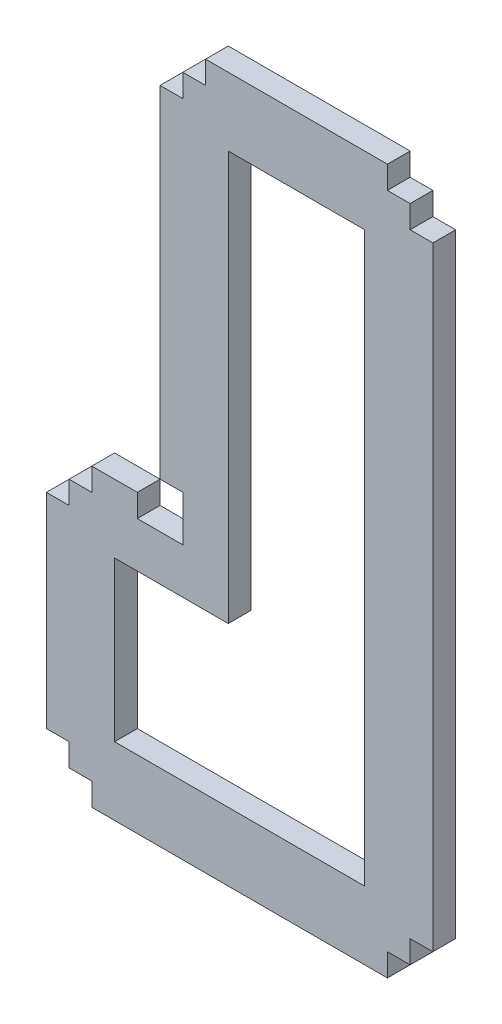
ISO-10303-21;
HEADER;
FILE_DESCRIPTION(('STEP AP214'),'2;1');
FILE_NAME('part.step','',(''),(''),'','','');
FILE_SCHEMA(('AUTOMOTIVE_DESIGN { 1 0 10303 214 1 1 1 1 }'));
ENDSEC;
DATA;
#1=APPLICATION_CONTEXT('core data for automotive mechanical design processes');
#2=APPLICATION_PROTOCOL_DEFINITION('international standard','automotive_design',2000,#1);
#3=PRODUCT_CONTEXT('',#1,'mechanical');
#4=PRODUCT('Part','Part','',(#3));
#5=PRODUCT_RELATED_PRODUCT_CATEGORY('part','',(#4));
#6=PRODUCT_DEFINITION_FORMATION('','',#4);
#7=PRODUCT_DEFINITION_CONTEXT('part definition',#1,'design');
#8=PRODUCT_DEFINITION('design','',#6,#7);
#9=PRODUCT_DEFINITION_SHAPE('','',#8);
#10=(LENGTH_UNIT() NAMED_UNIT(*) SI_UNIT(.MILLI.,.METRE.));
#11=(NAMED_UNIT(*) PLANE_ANGLE_UNIT() SI_UNIT($,.RADIAN.));
#12=(NAMED_UNIT(*) SI_UNIT($,.STERADIAN.) SOLID_ANGLE_UNIT());
#13=UNCERTAINTY_MEASURE_WITH_UNIT(LENGTH_MEASURE(1.E-05),#10,'distance_accuracy_value','');
#14=(GEOMETRIC_REPRESENTATION_CONTEXT(3) GLOBAL_UNCERTAINTY_ASSIGNED_CONTEXT((#13)) GLOBAL_UNIT_ASSIGNED_CONTEXT((#10,
#11,#12)) REPRESENTATION_CONTEXT('',''));
#15=CARTESIAN_POINT('',(0.,0.,0.));
#16=DIRECTION('',(0.,0.,1.));
#17=DIRECTION('',(1.,0.,0.));
#18=AXIS2_PLACEMENT_3D('',#15,#16,#17);
#19=CARTESIAN_POINT('',(12.7,-63.5,-9.525));
#20=DIRECTION('',(-1.,0.,0.));
#21=DIRECTION('',(0.,0.,1.));
#22=AXIS2_PLACEMENT_3D('',#19,#20,#21);
#23=PLANE('',#22);
#24=DIRECTION('',(0.,-1.,0.));
#25=VECTOR('',#24,1.);
#26=CARTESIAN_POINT('',(12.7,-63.5,-3.175));
#27=LINE('',#26,#25);
#28=CARTESIAN_POINT('',(12.7,-63.5,-3.175));
#29=VERTEX_POINT('',#28);
#30=CARTESIAN_POINT('',(12.7,-69.85,-3.175));
#31=VERTEX_POINT('',#30);
#32=EDGE_CURVE('E311',#29,#31,#27,.T.);
#33=ORIENTED_EDGE('',*,*,#32,.F.);
#34=DIRECTION('',(0.,0.,1.));
#35=VECTOR('',#34,1.);
#36=CARTESIAN_POINT('',(12.7,-63.5,-9.525));
#37=LINE('',#36,#35);
#38=CARTESIAN_POINT('',(12.7,-63.5,-9.525));
#39=VERTEX_POINT('',#38);
#40=EDGE_CURVE('E11',#39,#29,#37,.T.);
#41=ORIENTED_EDGE('',*,*,#40,.F.);
#42=DIRECTION('',(0.,-1.,0.));
#43=VECTOR('',#42,1.);
#44=CARTESIAN_POINT('',(12.7,-63.5,-9.525));
#45=LINE('',#44,#43);
#46=CARTESIAN_POINT('',(12.7,-69.85,-9.525));
#47=VERTEX_POINT('',#46);
#48=EDGE_CURVE('E319',#39,#47,#45,.T.);
#49=ORIENTED_EDGE('',*,*,#48,.T.);
#50=DIRECTION('',(0.,0.,1.));
#51=VECTOR('',#50,1.);
#52=CARTESIAN_POINT('',(12.7,-69.85,-9.525));
#53=LINE('',#52,#51);
#54=EDGE_CURVE('E36',#47,#31,#53,.T.);
#55=ORIENTED_EDGE('',*,*,#54,.T.);
#56=EDGE_LOOP('',(#33,#41,#49,#55));
#57=FACE_BOUND('',#56,.T.);
#58=ADVANCED_FACE('F33',(#57),#23,.T.);
#59=CARTESIAN_POINT('',(12.7,-63.5,-9.525));
#60=DIRECTION('',(0.,-1.,0.));
#61=DIRECTION('',(0.,0.,-1.));
#62=AXIS2_PLACEMENT_3D('',#59,#60,#61);
#63=PLANE('',#62);
#64=DIRECTION('',(1.,0.,0.));
#65=VECTOR('',#64,1.);
#66=CARTESIAN_POINT('',(12.7,-63.5,-3.175));
#67=LINE('',#66,#65);
#68=CARTESIAN_POINT('',(6.35000000000001,-63.5,-3.175));
#69=VERTEX_POINT('',#68);
#70=EDGE_CURVE('E323',#69,#29,#67,.T.);
#71=ORIENTED_EDGE('',*,*,#70,.F.);
#72=DIRECTION('',(0.,0.,1.));
#73=VECTOR('',#72,1.);
#74=CARTESIAN_POINT('',(6.35000000000001,-63.5,-9.525));
#75=LINE('',#74,#73);
#76=CARTESIAN_POINT('',(6.35000000000001,-63.5,-9.525));
#77=VERTEX_POINT('',#76);
#78=EDGE_CURVE('E41',#77,#69,#75,.T.);
#79=ORIENTED_EDGE('',*,*,#78,.F.);
#80=DIRECTION('',(1.,0.,0.));
#81=VECTOR('',#80,1.);
#82=CARTESIAN_POINT('',(12.7,-63.5,-9.525));
#83=LINE('',#82,#81);
#84=EDGE_CURVE('E407',#77,#39,#83,.T.);
#85=ORIENTED_EDGE('',*,*,#84,.T.);
#86=ORIENTED_EDGE('',*,*,#40,.T.);
#87=EDGE_LOOP('',(#71,#79,#85,#86));
#88=FACE_BOUND('',#87,.T.);
#89=ADVANCED_FACE('F564',(#88),#63,.T.);
#90=CARTESIAN_POINT('',(6.35000000000001,-63.5,-9.525));
#91=DIRECTION('',(-1.,0.,0.));
#92=DIRECTION('',(0.,0.,1.));
#93=AXIS2_PLACEMENT_3D('',#90,#91,#92);
#94=PLANE('',#93);
#95=DIRECTION('',(0.,-1.,0.));
#96=VECTOR('',#95,1.);
#97=CARTESIAN_POINT('',(6.35000000000001,-63.5,-3.175));
#98=LINE('',#97,#96);
#99=CARTESIAN_POINT('',(6.35000000000001,-6.34999999999999,-3.175));
#100=VERTEX_POINT('',#99);
#101=EDGE_CURVE('E493',#100,#69,#98,.T.);
#102=ORIENTED_EDGE('',*,*,#101,.F.);
#103=DIRECTION('',(0.,0.,1.));
#104=VECTOR('',#103,1.);
#105=CARTESIAN_POINT('',(6.35000000000001,-6.34999999999999,-9.525));
#106=LINE('',#105,#104);
#107=CARTESIAN_POINT('',(6.35000000000001,-6.34999999999999,-9.525));
#108=VERTEX_POINT('',#107);
#109=EDGE_CURVE('E499',#108,#100,#106,.T.);
#110=ORIENTED_EDGE('',*,*,#109,.F.);
#111=DIRECTION('',(0.,-1.,0.));
#112=VECTOR('',#111,1.);
#113=CARTESIAN_POINT('',(6.35000000000001,-63.5,-9.525));
#114=LINE('',#113,#112);
#115=EDGE_CURVE('E404',#108,#77,#114,.T.);
#116=ORIENTED_EDGE('',*,*,#115,.T.);
#117=ORIENTED_EDGE('',*,*,#78,.T.);
#118=EDGE_LOOP('',(#102,#110,#116,#117));
#119=FACE_BOUND('',#118,.T.);
#120=ADVANCED_FACE('F671',(#119),#94,.T.);
#121=CARTESIAN_POINT('',(12.7,-6.34999999999999,-9.525));
#122=DIRECTION('',(0.,1.,0.));
#123=DIRECTION('',(-1.,0.,0.));
#124=AXIS2_PLACEMENT_3D('',#121,#122,#123);
#125=PLANE('',#124);
#126=DIRECTION('',(-1.,0.,0.));
#127=VECTOR('',#126,1.);
#128=CARTESIAN_POINT('',(12.7,-6.34999999999999,-3.175));
#129=LINE('',#128,#127);
#130=CARTESIAN_POINT('',(12.7,-6.34999999999999,-3.175));
#131=VERTEX_POINT('',#130);
#132=EDGE_CURVE('E490',#131,#100,#129,.T.);
#133=ORIENTED_EDGE('',*,*,#132,.F.);
#134=DIRECTION('',(0.,0.,1.));
#135=VECTOR('',#134,1.);
#136=CARTESIAN_POINT('',(12.7,-6.34999999999999,-9.525));
#137=LINE('',#136,#135);
#138=CARTESIAN_POINT('',(12.7,-6.34999999999999,-9.525));
#139=VERTEX_POINT('',#138);
#140=EDGE_CURVE('E501',#139,#131,#137,.T.);
#141=ORIENTED_EDGE('',*,*,#140,.F.);
#142=DIRECTION('',(-1.,0.,0.));
#143=VECTOR('',#142,1.);
#144=CARTESIAN_POINT('',(12.7,-6.34999999999999,-9.525));
#145=LINE('',#144,#143);
#146=EDGE_CURVE('E401',#139,#108,#145,.T.);
#147=ORIENTED_EDGE('',*,*,#146,.T.);
#148=ORIENTED_EDGE('',*,*,#109,.T.);
#149=EDGE_LOOP('',(#133,#141,#147,#148));
#150=FACE_BOUND('',#149,.T.);
#151=ADVANCED_FACE('F668',(#150),#125,.T.);
#152=CARTESIAN_POINT('',(12.7,0.,-9.525));
#153=DIRECTION('',(-1.,0.,0.));
#154=DIRECTION('',(0.,0.,1.));
#155=AXIS2_PLACEMENT_3D('',#152,#153,#154);
#156=PLANE('',#155);
#157=DIRECTION('',(0.,-1.,0.));
#158=VECTOR('',#157,1.);
#159=CARTESIAN_POINT('',(12.7,0.,-3.175));
#160=LINE('',#159,#158);
#161=CARTESIAN_POINT('',(12.7,0.,-3.175));
#162=VERTEX_POINT('',#161);
#163=EDGE_CURVE('E487',#162,#131,#160,.T.);
#164=ORIENTED_EDGE('',*,*,#163,.F.);
#165=DIRECTION('',(0.,0.,1.));
#166=VECTOR('',#165,1.);
#167=CARTESIAN_POINT('',(12.7,0.,-9.525));
#168=LINE('',#167,#166);
#169=CARTESIAN_POINT('',(12.7,0.,-9.525));
#170=VERTEX_POINT('',#169);
#171=EDGE_CURVE('E503',#170,#162,#168,.T.);
#172=ORIENTED_EDGE('',*,*,#171,.F.);
#173=DIRECTION('',(0.,-1.,0.));
#174=VECTOR('',#173,1.);
#175=CARTESIAN_POINT('',(12.7,0.,-9.525));
#176=LINE('',#175,#174);
#177=EDGE_CURVE('E398',#170,#139,#176,.T.);
#178=ORIENTED_EDGE('',*,*,#177,.T.);
#179=ORIENTED_EDGE('',*,*,#140,.T.);
#180=EDGE_LOOP('',(#164,#172,#178,#179));
#181=FACE_BOUND('',#180,.T.);
#182=ADVANCED_FACE('F665',(#181),#156,.T.);
#183=CARTESIAN_POINT('',(19.05,0.,-9.525));
#184=DIRECTION('',(0.,1.,0.));
#185=DIRECTION('',(-1.,0.,0.));
#186=AXIS2_PLACEMENT_3D('',#183,#184,#185);
#187=PLANE('',#186);
#188=DIRECTION('',(-1.,0.,0.));
#189=VECTOR('',#188,1.);
#190=CARTESIAN_POINT('',(19.05,0.,-3.175));
#191=LINE('',#190,#189);
#192=CARTESIAN_POINT('',(19.05,0.,-3.175));
#193=VERTEX_POINT('',#192);
#194=EDGE_CURVE('E484',#193,#162,#191,.T.);
#195=ORIENTED_EDGE('',*,*,#194,.F.);
#196=DIRECTION('',(0.,0.,1.));
#197=VECTOR('',#196,1.);
#198=CARTESIAN_POINT('',(19.05,0.,-9.525));
#199=LINE('',#198,#197);
#200=CARTESIAN_POINT('',(19.05,0.,-9.525));
#201=VERTEX_POINT('',#200);
#202=EDGE_CURVE('E505',#201,#193,#199,.T.);
#203=ORIENTED_EDGE('',*,*,#202,.F.);
#204=DIRECTION('',(-1.,0.,0.));
#205=VECTOR('',#204,1.);
#206=CARTESIAN_POINT('',(19.05,0.,-9.525));
#207=LINE('',#206,#205);
#208=EDGE_CURVE('E395',#201,#170,#207,.T.);
#209=ORIENTED_EDGE('',*,*,#208,.T.);
#210=ORIENTED_EDGE('',*,*,#171,.T.);
#211=EDGE_LOOP('',(#195,#203,#209,#210));
#212=FACE_BOUND('',#211,.T.);
#213=ADVANCED_FACE('F661',(#212),#187,.T.);
#214=CARTESIAN_POINT('',(19.05,0.,-9.525));
#215=DIRECTION('',(-1.,0.,0.));
#216=DIRECTION('',(0.,0.,1.));
#217=AXIS2_PLACEMENT_3D('',#214,#215,#216);
#218=PLANE('',#217);
#219=DIRECTION('',(0.,-1.,0.));
#220=VECTOR('',#219,1.);
#221=CARTESIAN_POINT('',(19.05,0.,-3.175));
#222=LINE('',#221,#220);
#223=CARTESIAN_POINT('',(19.05,6.35,-3.175));
#224=VERTEX_POINT('',#223);
#225=EDGE_CURVE('E481',#224,#193,#222,.T.);
#226=ORIENTED_EDGE('',*,*,#225,.F.);
#227=DIRECTION('',(0.,0.,1.));
#228=VECTOR('',#227,1.);
#229=CARTESIAN_POINT('',(19.05,6.35,-9.525));
#230=LINE('',#229,#228);
#231=CARTESIAN_POINT('',(19.05,6.35,-9.525));
#232=VERTEX_POINT('',#231);
#233=EDGE_CURVE('E507',#232,#224,#230,.T.);
#234=ORIENTED_EDGE('',*,*,#233,.F.);
#235=DIRECTION('',(0.,-1.,0.));
#236=VECTOR('',#235,1.);
#237=CARTESIAN_POINT('',(19.05,0.,-9.525));
#238=LINE('',#237,#236);
#239=EDGE_CURVE('E392',#232,#201,#238,.T.);
#240=ORIENTED_EDGE('',*,*,#239,.T.);
#241=ORIENTED_EDGE('',*,*,#202,.T.);
#242=EDGE_LOOP('',(#226,#234,#240,#241));
#243=FACE_BOUND('',#242,.T.);
#244=ADVANCED_FACE('F657',(#243),#218,.T.);
#245=CARTESIAN_POINT('',(19.05,6.35,-9.525));
#246=DIRECTION('',(0.,1.,0.));
#247=DIRECTION('',(0.,0.,1.));
#248=AXIS2_PLACEMENT_3D('',#245,#246,#247);
#249=PLANE('',#248);
#250=DIRECTION('',(-1.,0.,0.));
#251=VECTOR('',#250,1.);
#252=CARTESIAN_POINT('',(19.05,6.35,-3.175));
#253=LINE('',#252,#251);
#254=CARTESIAN_POINT('',(31.75,6.35,-3.175));
#255=VERTEX_POINT('',#254);
#256=EDGE_CURVE('E478',#255,#224,#253,.T.);
#257=ORIENTED_EDGE('',*,*,#256,.F.);
#258=DIRECTION('',(0.,0.,1.));
#259=VECTOR('',#258,1.);
#260=CARTESIAN_POINT('',(31.75,6.35,-9.525));
#261=LINE('',#260,#259);
#262=CARTESIAN_POINT('',(31.75,6.35,-9.525));
#263=VERTEX_POINT('',#262);
#264=EDGE_CURVE('E509',#263,#255,#261,.T.);
#265=ORIENTED_EDGE('',*,*,#264,.F.);
#266=DIRECTION('',(-1.,0.,0.));
#267=VECTOR('',#266,1.);
#268=CARTESIAN_POINT('',(19.05,6.35,-9.525));
#269=LINE('',#268,#267);
#270=EDGE_CURVE('E389',#263,#232,#269,.T.);
#271=ORIENTED_EDGE('',*,*,#270,.T.);
#272=ORIENTED_EDGE('',*,*,#233,.T.);
#273=EDGE_LOOP('',(#257,#265,#271,#272));
#274=FACE_BOUND('',#273,.T.);
#275=ADVANCED_FACE('F653',(#274),#249,.T.);
#276=CARTESIAN_POINT('',(31.75,0.,-9.525));
#277=DIRECTION('',(1.,0.,0.));
#278=DIRECTION('',(0.,0.,-1.));
#279=AXIS2_PLACEMENT_3D('',#276,#277,#278);
#280=PLANE('',#279);
#281=DIRECTION('',(0.,1.,0.));
#282=VECTOR('',#281,1.);
#283=CARTESIAN_POINT('',(31.75,0.,-3.175));
#284=LINE('',#283,#282);
#285=CARTESIAN_POINT('',(31.75,0.,-3.175));
#286=VERTEX_POINT('',#285);
#287=EDGE_CURVE('E475',#286,#255,#284,.T.);
#288=ORIENTED_EDGE('',*,*,#287,.F.);
#289=DIRECTION('',(0.,0.,1.));
#290=VECTOR('',#289,1.);
#291=CARTESIAN_POINT('',(31.75,0.,-9.525));
#292=LINE('',#291,#290);
#293=CARTESIAN_POINT('',(31.75,0.,-9.525));
#294=VERTEX_POINT('',#293);
#295=EDGE_CURVE('E511',#294,#286,#292,.T.);
#296=ORIENTED_EDGE('',*,*,#295,.F.);
#297=DIRECTION('',(0.,1.,0.));
#298=VECTOR('',#297,1.);
#299=CARTESIAN_POINT('',(31.75,0.,-9.525));
#300=LINE('',#299,#298);
#301=EDGE_CURVE('E386',#294,#263,#300,.T.);
#302=ORIENTED_EDGE('',*,*,#301,.T.);
#303=ORIENTED_EDGE('',*,*,#264,.T.);
#304=EDGE_LOOP('',(#288,#296,#302,#303));
#305=FACE_BOUND('',#304,.T.);
#306=ADVANCED_FACE('F649',(#305),#280,.T.);
#307=CARTESIAN_POINT('',(44.45,0.,-9.525));
#308=DIRECTION('',(0.,1.,0.));
#309=DIRECTION('',(-1.,0.,0.));
#310=AXIS2_PLACEMENT_3D('',#307,#308,#309);
#311=PLANE('',#310);
#312=DIRECTION('',(-1.,0.,0.));
#313=VECTOR('',#312,1.);
#314=CARTESIAN_POINT('',(44.45,0.,-3.175));
#315=LINE('',#314,#313);
#316=CARTESIAN_POINT('',(44.45,0.,-3.175));
#317=VERTEX_POINT('',#316);
#318=EDGE_CURVE('E472',#317,#286,#315,.T.);
#319=ORIENTED_EDGE('',*,*,#318,.F.);
#320=DIRECTION('',(0.,0.,1.));
#321=VECTOR('',#320,1.);
#322=CARTESIAN_POINT('',(44.45,0.,-9.525));
#323=LINE('',#322,#321);
#324=CARTESIAN_POINT('',(44.45,0.,-9.525));
#325=VERTEX_POINT('',#324);
#326=EDGE_CURVE('E513',#325,#317,#323,.T.);
#327=ORIENTED_EDGE('',*,*,#326,.F.);
#328=DIRECTION('',(-1.,0.,0.));
#329=VECTOR('',#328,1.);
#330=CARTESIAN_POINT('',(44.45,0.,-9.525));
#331=LINE('',#330,#329);
#332=EDGE_CURVE('E383',#325,#294,#331,.T.);
#333=ORIENTED_EDGE('',*,*,#332,.T.);
#334=ORIENTED_EDGE('',*,*,#295,.T.);
#335=EDGE_LOOP('',(#319,#327,#333,#334));
#336=FACE_BOUND('',#335,.T.);
#337=ADVANCED_FACE('F645',(#336),#311,.T.);
#338=CARTESIAN_POINT('',(44.45,12.7,-9.525));
#339=DIRECTION('',(-1.,0.,0.));
#340=DIRECTION('',(0.,-1.,0.));
#341=AXIS2_PLACEMENT_3D('',#338,#339,#340);
#342=PLANE('',#341);
#343=DIRECTION('',(0.,-1.,0.));
#344=VECTOR('',#343,1.);
#345=CARTESIAN_POINT('',(44.45,12.7,-3.175));
#346=LINE('',#345,#344);
#347=CARTESIAN_POINT('',(44.45,12.7,-3.175));
#348=VERTEX_POINT('',#347);
#349=EDGE_CURVE('E469',#348,#317,#346,.T.);
#350=ORIENTED_EDGE('',*,*,#349,.F.);
#351=DIRECTION('',(0.,0.,1.));
#352=VECTOR('',#351,1.);
#353=CARTESIAN_POINT('',(44.45,12.7,-9.525));
#354=LINE('',#353,#352);
#355=CARTESIAN_POINT('',(44.45,12.7,-9.525));
#356=VERTEX_POINT('',#355);
#357=EDGE_CURVE('E515',#356,#348,#354,.T.);
#358=ORIENTED_EDGE('',*,*,#357,.F.);
#359=DIRECTION('',(0.,-1.,0.));
#360=VECTOR('',#359,1.);
#361=CARTESIAN_POINT('',(44.45,12.7,-9.525));
#362=LINE('',#361,#360);
#363=EDGE_CURVE('E380',#356,#325,#362,.T.);
#364=ORIENTED_EDGE('',*,*,#363,.T.);
#365=ORIENTED_EDGE('',*,*,#326,.T.);
#366=EDGE_LOOP('',(#350,#358,#364,#365));
#367=FACE_BOUND('',#366,.T.);
#368=ADVANCED_FACE('F641',(#367),#342,.T.);
#369=CARTESIAN_POINT('',(44.45,12.7,-9.525));
#370=DIRECTION('',(0.,-1.,0.));
#371=DIRECTION('',(1.,0.,0.));
#372=AXIS2_PLACEMENT_3D('',#369,#370,#371);
#373=PLANE('',#372);
#374=DIRECTION('',(1.,0.,0.));
#375=VECTOR('',#374,1.);
#376=CARTESIAN_POINT('',(44.45,12.7,-3.175));
#377=LINE('',#376,#375);
#378=CARTESIAN_POINT('',(38.1,12.7,-3.175));
#379=VERTEX_POINT('',#378);
#380=EDGE_CURVE('E466',#379,#348,#377,.T.);
#381=ORIENTED_EDGE('',*,*,#380,.F.);
#382=DIRECTION('',(0.,0.,1.));
#383=VECTOR('',#382,1.);
#384=CARTESIAN_POINT('',(38.1,12.7,-9.525));
#385=LINE('',#384,#383);
#386=CARTESIAN_POINT('',(38.1,12.7,-9.525));
#387=VERTEX_POINT('',#386);
#388=EDGE_CURVE('E517',#387,#379,#385,.T.);
#389=ORIENTED_EDGE('',*,*,#388,.F.);
#390=DIRECTION('',(1.,0.,0.));
#391=VECTOR('',#390,1.);
#392=CARTESIAN_POINT('',(44.45,12.7,-9.525));
#393=LINE('',#392,#391);
#394=EDGE_CURVE('E377',#387,#356,#393,.T.);
#395=ORIENTED_EDGE('',*,*,#394,.T.);
#396=ORIENTED_EDGE('',*,*,#357,.T.);
#397=EDGE_LOOP('',(#381,#389,#395,#396));
#398=FACE_BOUND('',#397,.T.);
#399=ADVANCED_FACE('F637',(#398),#373,.T.);
#400=CARTESIAN_POINT('',(38.1,107.95,-9.525));
#401=DIRECTION('',(-1.,0.,0.));
#402=DIRECTION('',(0.,0.,1.));
#403=AXIS2_PLACEMENT_3D('',#400,#401,#402);
#404=PLANE('',#403);
#405=DIRECTION('',(0.,-1.,0.));
#406=VECTOR('',#405,1.);
#407=CARTESIAN_POINT('',(38.1,107.95,-3.175));
#408=LINE('',#407,#406);
#409=CARTESIAN_POINT('',(38.1,107.95,-3.175));
#410=VERTEX_POINT('',#409);
#411=EDGE_CURVE('E463',#410,#379,#408,.T.);
#412=ORIENTED_EDGE('',*,*,#411,.F.);
#413=DIRECTION('',(0.,0.,1.));
#414=VECTOR('',#413,1.);
#415=CARTESIAN_POINT('',(38.1,107.95,-9.525));
#416=LINE('',#415,#414);
#417=CARTESIAN_POINT('',(38.1,107.95,-9.525));
#418=VERTEX_POINT('',#417);
#419=EDGE_CURVE('E519',#418,#410,#416,.T.);
#420=ORIENTED_EDGE('',*,*,#419,.F.);
#421=DIRECTION('',(0.,-1.,0.));
#422=VECTOR('',#421,1.);
#423=CARTESIAN_POINT('',(38.1,107.95,-9.525));
#424=LINE('',#423,#422);
#425=EDGE_CURVE('E374',#418,#387,#424,.T.);
#426=ORIENTED_EDGE('',*,*,#425,.T.);
#427=ORIENTED_EDGE('',*,*,#388,.T.);
#428=EDGE_LOOP('',(#412,#420,#426,#427));
#429=FACE_BOUND('',#428,.T.);
#430=ADVANCED_FACE('F633',(#429),#404,.T.);
#431=CARTESIAN_POINT('',(44.45,107.95,-9.525));
#432=DIRECTION('',(0.,1.,0.));
#433=DIRECTION('',(0.,0.,1.));
#434=AXIS2_PLACEMENT_3D('',#431,#432,#433);
#435=PLANE('',#434);
#436=DIRECTION('',(-1.,0.,0.));
#437=VECTOR('',#436,1.);
#438=CARTESIAN_POINT('',(44.45,107.95,-3.175));
#439=LINE('',#438,#437);
#440=CARTESIAN_POINT('',(44.45,107.95,-3.175));
#441=VERTEX_POINT('',#440);
#442=EDGE_CURVE('E460',#441,#410,#439,.T.);
#443=ORIENTED_EDGE('',*,*,#442,.F.);
#444=DIRECTION('',(0.,0.,1.));
#445=VECTOR('',#444,1.);
#446=CARTESIAN_POINT('',(44.45,107.95,-9.525));
#447=LINE('',#446,#445);
#448=CARTESIAN_POINT('',(44.45,107.95,-9.525));
#449=VERTEX_POINT('',#448);
#450=EDGE_CURVE('E521',#449,#441,#447,.T.);
#451=ORIENTED_EDGE('',*,*,#450,.F.);
#452=DIRECTION('',(-1.,0.,0.));
#453=VECTOR('',#452,1.);
#454=CARTESIAN_POINT('',(44.45,107.95,-9.525));
#455=LINE('',#454,#453);
#456=EDGE_CURVE('E371',#449,#418,#455,.T.);
#457=ORIENTED_EDGE('',*,*,#456,.T.);
#458=ORIENTED_EDGE('',*,*,#419,.T.);
#459=EDGE_LOOP('',(#443,#451,#457,#458));
#460=FACE_BOUND('',#459,.T.);
#461=ADVANCED_FACE('F629',(#460),#435,.T.);
#462=CARTESIAN_POINT('',(44.45,114.3,-9.525));
#463=DIRECTION('',(-1.,0.,0.));
#464=DIRECTION('',(0.,0.,1.));
#465=AXIS2_PLACEMENT_3D('',#462,#463,#464);
#466=PLANE('',#465);
#467=DIRECTION('',(0.,-1.,0.));
#468=VECTOR('',#467,1.);
#469=CARTESIAN_POINT('',(44.45,114.3,-3.175));
#470=LINE('',#469,#468);
#471=CARTESIAN_POINT('',(44.45,114.3,-3.175));
#472=VERTEX_POINT('',#471);
#473=EDGE_CURVE('E457',#472,#441,#470,.T.);
#474=ORIENTED_EDGE('',*,*,#473,.F.);
#475=DIRECTION('',(0.,0.,1.));
#476=VECTOR('',#475,1.);
#477=CARTESIAN_POINT('',(44.45,114.3,-9.525));
#478=LINE('',#477,#476);
#479=CARTESIAN_POINT('',(44.45,114.3,-9.525));
#480=VERTEX_POINT('',#479);
#481=EDGE_CURVE('E523',#480,#472,#478,.T.);
#482=ORIENTED_EDGE('',*,*,#481,.F.);
#483=DIRECTION('',(0.,-1.,0.));
#484=VECTOR('',#483,1.);
#485=CARTESIAN_POINT('',(44.45,114.3,-9.525));
#486=LINE('',#485,#484);
#487=EDGE_CURVE('E368',#480,#449,#486,.T.);
#488=ORIENTED_EDGE('',*,*,#487,.T.);
#489=ORIENTED_EDGE('',*,*,#450,.T.);
#490=EDGE_LOOP('',(#474,#482,#488,#489));
#491=FACE_BOUND('',#490,.T.);
#492=ADVANCED_FACE('F625',(#491),#466,.T.);
#493=CARTESIAN_POINT('',(50.8,114.3,-9.525));
#494=DIRECTION('',(0.,1.,0.));
#495=DIRECTION('',(0.,0.,1.));
#496=AXIS2_PLACEMENT_3D('',#493,#494,#495);
#497=PLANE('',#496);
#498=DIRECTION('',(-1.,0.,0.));
#499=VECTOR('',#498,1.);
#500=CARTESIAN_POINT('',(50.8,114.3,-3.175));
#501=LINE('',#500,#499);
#502=CARTESIAN_POINT('',(50.8,114.3,-3.175));
#503=VERTEX_POINT('',#502);
#504=EDGE_CURVE('E454',#503,#472,#501,.T.);
#505=ORIENTED_EDGE('',*,*,#504,.F.);
#506=DIRECTION('',(0.,0.,1.));
#507=VECTOR('',#506,1.);
#508=CARTESIAN_POINT('',(50.8,114.3,-9.525));
#509=LINE('',#508,#507);
#510=CARTESIAN_POINT('',(50.8,114.3,-9.525));
#511=VERTEX_POINT('',#510);
#512=EDGE_CURVE('E525',#511,#503,#509,.T.);
#513=ORIENTED_EDGE('',*,*,#512,.F.);
#514=DIRECTION('',(-1.,0.,0.));
#515=VECTOR('',#514,1.);
#516=CARTESIAN_POINT('',(50.8,114.3,-9.525));
#517=LINE('',#516,#515);
#518=EDGE_CURVE('E365',#511,#480,#517,.T.);
#519=ORIENTED_EDGE('',*,*,#518,.T.);
#520=ORIENTED_EDGE('',*,*,#481,.T.);
#521=EDGE_LOOP('',(#505,#513,#519,#520));
#522=FACE_BOUND('',#521,.T.);
#523=ADVANCED_FACE('F621',(#522),#497,.T.);
#524=CARTESIAN_POINT('',(50.8,114.3,-9.525));
#525=DIRECTION('',(-1.,0.,0.));
#526=DIRECTION('',(0.,0.,1.));
#527=AXIS2_PLACEMENT_3D('',#524,#525,#526);
#528=PLANE('',#527);
#529=DIRECTION('',(0.,-1.,0.));
#530=VECTOR('',#529,1.);
#531=CARTESIAN_POINT('',(50.8,114.3,-3.175));
#532=LINE('',#531,#530);
#533=CARTESIAN_POINT('',(50.8,120.65,-3.175));
#534=VERTEX_POINT('',#533);
#535=EDGE_CURVE('E451',#534,#503,#532,.T.);
#536=ORIENTED_EDGE('',*,*,#535,.F.);
#537=DIRECTION('',(0.,0.,1.));
#538=VECTOR('',#537,1.);
#539=CARTESIAN_POINT('',(50.8,120.65,-9.525));
#540=LINE('',#539,#538);
#541=CARTESIAN_POINT('',(50.8,120.65,-9.525));
#542=VERTEX_POINT('',#541);
#543=EDGE_CURVE('E527',#542,#534,#540,.T.);
#544=ORIENTED_EDGE('',*,*,#543,.F.);
#545=DIRECTION('',(0.,-1.,0.));
#546=VECTOR('',#545,1.);
#547=CARTESIAN_POINT('',(50.8,114.3,-9.525));
#548=LINE('',#547,#546);
#549=EDGE_CURVE('E362',#542,#511,#548,.T.);
#550=ORIENTED_EDGE('',*,*,#549,.T.);
#551=ORIENTED_EDGE('',*,*,#512,.T.);
#552=EDGE_LOOP('',(#536,#544,#550,#551));
#553=FACE_BOUND('',#552,.T.);
#554=ADVANCED_FACE('F617',(#553),#528,.T.);
#555=CARTESIAN_POINT('',(101.6,120.65,-9.525));
#556=DIRECTION('',(0.,1.,0.));
#557=DIRECTION('',(0.,0.,1.));
#558=AXIS2_PLACEMENT_3D('',#555,#556,#557);
#559=PLANE('',#558);
#560=DIRECTION('',(-1.,0.,0.));
#561=VECTOR('',#560,1.);
#562=CARTESIAN_POINT('',(101.6,120.65,-3.175));
#563=LINE('',#562,#561);
#564=CARTESIAN_POINT('',(101.6,120.65,-3.175));
#565=VERTEX_POINT('',#564);
#566=EDGE_CURVE('E448',#565,#534,#563,.T.);
#567=ORIENTED_EDGE('',*,*,#566,.F.);
#568=DIRECTION('',(0.,0.,1.));
#569=VECTOR('',#568,1.);
#570=CARTESIAN_POINT('',(101.6,120.65,-9.525));
#571=LINE('',#570,#569);
#572=CARTESIAN_POINT('',(101.6,120.65,-9.525));
#573=VERTEX_POINT('',#572);
#574=EDGE_CURVE('E529',#573,#565,#571,.T.);
#575=ORIENTED_EDGE('',*,*,#574,.F.);
#576=DIRECTION('',(-1.,0.,0.));
#577=VECTOR('',#576,1.);
#578=CARTESIAN_POINT('',(101.6,120.65,-9.525));
#579=LINE('',#578,#577);
#580=EDGE_CURVE('E359',#573,#542,#579,.T.);
#581=ORIENTED_EDGE('',*,*,#580,.T.);
#582=ORIENTED_EDGE('',*,*,#543,.T.);
#583=EDGE_LOOP('',(#567,#575,#581,#582));
#584=FACE_BOUND('',#583,.T.);
#585=ADVANCED_FACE('F613',(#584),#559,.T.);
#586=CARTESIAN_POINT('',(101.6,114.3,-9.525));
#587=DIRECTION('',(1.,0.,0.));
#588=DIRECTION('',(0.,0.,-1.));
#589=AXIS2_PLACEMENT_3D('',#586,#587,#588);
#590=PLANE('',#589);
#591=DIRECTION('',(0.,1.,0.));
#592=VECTOR('',#591,1.);
#593=CARTESIAN_POINT('',(101.6,114.3,-3.175));
#594=LINE('',#593,#592);
#595=CARTESIAN_POINT('',(101.6,114.3,-3.175));
#596=VERTEX_POINT('',#595);
#597=EDGE_CURVE('E445',#596,#565,#594,.T.);
#598=ORIENTED_EDGE('',*,*,#597,.F.);
#599=DIRECTION('',(0.,0.,1.));
#600=VECTOR('',#599,1.);
#601=CARTESIAN_POINT('',(101.6,114.3,-9.525));
#602=LINE('',#601,#600);
#603=CARTESIAN_POINT('',(101.6,114.3,-9.525));
#604=VERTEX_POINT('',#603);
#605=EDGE_CURVE('E531',#604,#596,#602,.T.);
#606=ORIENTED_EDGE('',*,*,#605,.F.);
#607=DIRECTION('',(0.,1.,0.));
#608=VECTOR('',#607,1.);
#609=CARTESIAN_POINT('',(101.6,114.3,-9.525));
#610=LINE('',#609,#608);
#611=EDGE_CURVE('E356',#604,#573,#610,.T.);
#612=ORIENTED_EDGE('',*,*,#611,.T.);
#613=ORIENTED_EDGE('',*,*,#574,.T.);
#614=EDGE_LOOP('',(#598,#606,#612,#613));
#615=FACE_BOUND('',#614,.T.);
#616=ADVANCED_FACE('F609',(#615),#590,.T.);
#617=CARTESIAN_POINT('',(107.95,114.3,-9.525));
#618=DIRECTION('',(0.,1.,0.));
#619=DIRECTION('',(0.,0.,1.));
#620=AXIS2_PLACEMENT_3D('',#617,#618,#619);
#621=PLANE('',#620);
#622=DIRECTION('',(-1.,0.,0.));
#623=VECTOR('',#622,1.);
#624=CARTESIAN_POINT('',(107.95,114.3,-3.175));
#625=LINE('',#624,#623);
#626=CARTESIAN_POINT('',(107.95,114.3,-3.175));
#627=VERTEX_POINT('',#626);
#628=EDGE_CURVE('E442',#627,#596,#625,.T.);
#629=ORIENTED_EDGE('',*,*,#628,.F.);
#630=DIRECTION('',(0.,0.,1.));
#631=VECTOR('',#630,1.);
#632=CARTESIAN_POINT('',(107.95,114.3,-9.525));
#633=LINE('',#632,#631);
#634=CARTESIAN_POINT('',(107.95,114.3,-9.525));
#635=VERTEX_POINT('',#634);
#636=EDGE_CURVE('E533',#635,#627,#633,.T.);
#637=ORIENTED_EDGE('',*,*,#636,.F.);
#638=DIRECTION('',(-1.,0.,0.));
#639=VECTOR('',#638,1.);
#640=CARTESIAN_POINT('',(107.95,114.3,-9.525));
#641=LINE('',#640,#639);
#642=EDGE_CURVE('E353',#635,#604,#641,.T.);
#643=ORIENTED_EDGE('',*,*,#642,.T.);
#644=ORIENTED_EDGE('',*,*,#605,.T.);
#645=EDGE_LOOP('',(#629,#637,#643,#644));
#646=FACE_BOUND('',#645,.T.);
#647=ADVANCED_FACE('F605',(#646),#621,.T.);
#648=CARTESIAN_POINT('',(107.95,107.95,-9.525));
#649=DIRECTION('',(1.,0.,0.));
#650=DIRECTION('',(0.,1.,0.));
#651=AXIS2_PLACEMENT_3D('',#648,#649,#650);
#652=PLANE('',#651);
#653=DIRECTION('',(0.,1.,0.));
#654=VECTOR('',#653,1.);
#655=CARTESIAN_POINT('',(107.95,107.95,-3.175));
#656=LINE('',#655,#654);
#657=CARTESIAN_POINT('',(107.95,107.95,-3.175));
#658=VERTEX_POINT('',#657);
#659=EDGE_CURVE('E439',#658,#627,#656,.T.);
#660=ORIENTED_EDGE('',*,*,#659,.F.);
#661=DIRECTION('',(0.,0.,1.));
#662=VECTOR('',#661,1.);
#663=CARTESIAN_POINT('',(107.95,107.95,-9.525));
#664=LINE('',#663,#662);
#665=CARTESIAN_POINT('',(107.95,107.95,-9.525));
#666=VERTEX_POINT('',#665);
#667=EDGE_CURVE('E535',#666,#658,#664,.T.);
#668=ORIENTED_EDGE('',*,*,#667,.F.);
#669=DIRECTION('',(0.,1.,0.));
#670=VECTOR('',#669,1.);
#671=CARTESIAN_POINT('',(107.95,107.95,-9.525));
#672=LINE('',#671,#670);
#673=EDGE_CURVE('E350',#666,#635,#672,.T.);
#674=ORIENTED_EDGE('',*,*,#673,.T.);
#675=ORIENTED_EDGE('',*,*,#636,.T.);
#676=EDGE_LOOP('',(#660,#668,#674,#675));
#677=FACE_BOUND('',#676,.T.);
#678=ADVANCED_FACE('F601',(#677),#652,.T.);
#679=CARTESIAN_POINT('',(107.95,107.95,-9.525));
#680=DIRECTION('',(0.,1.,0.));
#681=DIRECTION('',(-1.,0.,0.));
#682=AXIS2_PLACEMENT_3D('',#679,#680,#681);
#683=PLANE('',#682);
#684=DIRECTION('',(-1.,0.,0.));
#685=VECTOR('',#684,1.);
#686=CARTESIAN_POINT('',(107.95,107.95,-3.175));
#687=LINE('',#686,#685);
#688=CARTESIAN_POINT('',(114.3,107.95,-3.175));
#689=VERTEX_POINT('',#688);
#690=EDGE_CURVE('E436',#689,#658,#687,.T.);
#691=ORIENTED_EDGE('',*,*,#690,.F.);
#692=DIRECTION('',(0.,0.,1.));
#693=VECTOR('',#692,1.);
#694=CARTESIAN_POINT('',(114.3,107.95,-9.525));
#695=LINE('',#694,#693);
#696=CARTESIAN_POINT('',(114.3,107.95,-9.525));
#697=VERTEX_POINT('',#696);
#698=EDGE_CURVE('E537',#697,#689,#695,.T.);
#699=ORIENTED_EDGE('',*,*,#698,.F.);
#700=DIRECTION('',(-1.,0.,0.));
#701=VECTOR('',#700,1.);
#702=CARTESIAN_POINT('',(107.95,107.95,-9.525));
#703=LINE('',#702,#701);
#704=EDGE_CURVE('E347',#697,#666,#703,.T.);
#705=ORIENTED_EDGE('',*,*,#704,.T.);
#706=ORIENTED_EDGE('',*,*,#667,.T.);
#707=EDGE_LOOP('',(#691,#699,#705,#706));
#708=FACE_BOUND('',#707,.T.);
#709=ADVANCED_FACE('F597',(#708),#683,.T.);
#710=CARTESIAN_POINT('',(114.3,-63.5,-9.525));
#711=DIRECTION('',(1.,0.,0.));
#712=DIRECTION('',(0.,0.,-1.));
#713=AXIS2_PLACEMENT_3D('',#710,#711,#712);
#714=PLANE('',#713);
#715=DIRECTION('',(0.,1.,0.));
#716=VECTOR('',#715,1.);
#717=CARTESIAN_POINT('',(114.3,-63.5,-3.175));
#718=LINE('',#717,#716);
#719=CARTESIAN_POINT('',(114.3,-63.5,-3.175));
#720=VERTEX_POINT('',#719);
#721=EDGE_CURVE('E433',#720,#689,#718,.T.);
#722=ORIENTED_EDGE('',*,*,#721,.F.);
#723=DIRECTION('',(0.,0.,1.));
#724=VECTOR('',#723,1.);
#725=CARTESIAN_POINT('',(114.3,-63.5,-9.525));
#726=LINE('',#725,#724);
#727=CARTESIAN_POINT('',(114.3,-63.5,-9.525));
#728=VERTEX_POINT('',#727);
#729=EDGE_CURVE('E539',#728,#720,#726,.T.);
#730=ORIENTED_EDGE('',*,*,#729,.F.);
#731=DIRECTION('',(0.,1.,0.));
#732=VECTOR('',#731,1.);
#733=CARTESIAN_POINT('',(114.3,-63.5,-9.525));
#734=LINE('',#733,#732);
#735=EDGE_CURVE('E344',#728,#697,#734,.T.);
#736=ORIENTED_EDGE('',*,*,#735,.T.);
#737=ORIENTED_EDGE('',*,*,#698,.T.);
#738=EDGE_LOOP('',(#722,#730,#736,#737));
#739=FACE_BOUND('',#738,.T.);
#740=ADVANCED_FACE('F593',(#739),#714,.T.);
#741=CARTESIAN_POINT('',(107.95,-63.5,-9.525));
#742=DIRECTION('',(0.,-1.,0.));
#743=DIRECTION('',(0.,0.,-1.));
#744=AXIS2_PLACEMENT_3D('',#741,#742,#743);
#745=PLANE('',#744);
#746=DIRECTION('',(1.,0.,0.));
#747=VECTOR('',#746,1.);
#748=CARTESIAN_POINT('',(107.95,-63.5,-3.175));
#749=LINE('',#748,#747);
#750=CARTESIAN_POINT('',(107.95,-63.5,-3.175));
#751=VERTEX_POINT('',#750);
#752=EDGE_CURVE('E430',#751,#720,#749,.T.);
#753=ORIENTED_EDGE('',*,*,#752,.F.);
#754=DIRECTION('',(0.,0.,1.));
#755=VECTOR('',#754,1.);
#756=CARTESIAN_POINT('',(107.95,-63.5,-9.525));
#757=LINE('',#756,#755);
#758=CARTESIAN_POINT('',(107.95,-63.5,-9.525));
#759=VERTEX_POINT('',#758);
#760=EDGE_CURVE('E541',#759,#751,#757,.T.);
#761=ORIENTED_EDGE('',*,*,#760,.F.);
#762=DIRECTION('',(1.,0.,0.));
#763=VECTOR('',#762,1.);
#764=CARTESIAN_POINT('',(107.95,-63.5,-9.525));
#765=LINE('',#764,#763);
#766=EDGE_CURVE('E341',#759,#728,#765,.T.);
#767=ORIENTED_EDGE('',*,*,#766,.T.);
#768=ORIENTED_EDGE('',*,*,#729,.T.);
#769=EDGE_LOOP('',(#753,#761,#767,#768));
#770=FACE_BOUND('',#769,.T.);
#771=ADVANCED_FACE('F589',(#770),#745,.T.);
#772=CARTESIAN_POINT('',(107.95,-69.85,-9.525));
#773=DIRECTION('',(1.,0.,0.));
#774=DIRECTION('',(0.,0.,-1.));
#775=AXIS2_PLACEMENT_3D('',#772,#773,#774);
#776=PLANE('',#775);
#777=DIRECTION('',(0.,1.,0.));
#778=VECTOR('',#777,1.);
#779=CARTESIAN_POINT('',(107.95,-69.85,-3.175));
#780=LINE('',#779,#778);
#781=CARTESIAN_POINT('',(107.95,-69.85,-3.175));
#782=VERTEX_POINT('',#781);
#783=EDGE_CURVE('E427',#782,#751,#780,.T.);
#784=ORIENTED_EDGE('',*,*,#783,.F.);
#785=DIRECTION('',(0.,0.,1.));
#786=VECTOR('',#785,1.);
#787=CARTESIAN_POINT('',(107.95,-69.85,-9.525));
#788=LINE('',#787,#786);
#789=CARTESIAN_POINT('',(107.95,-69.85,-9.525));
#790=VERTEX_POINT('',#789);
#791=EDGE_CURVE('E543',#790,#782,#788,.T.);
#792=ORIENTED_EDGE('',*,*,#791,.F.);
#793=DIRECTION('',(0.,1.,0.));
#794=VECTOR('',#793,1.);
#795=CARTESIAN_POINT('',(107.95,-69.85,-9.525));
#796=LINE('',#795,#794);
#797=EDGE_CURVE('E338',#790,#759,#796,.T.);
#798=ORIENTED_EDGE('',*,*,#797,.T.);
#799=ORIENTED_EDGE('',*,*,#760,.T.);
#800=EDGE_LOOP('',(#784,#792,#798,#799));
#801=FACE_BOUND('',#800,.T.);
#802=ADVANCED_FACE('F585',(#801),#776,.T.);
#803=CARTESIAN_POINT('',(101.6,-69.85,-9.525));
#804=DIRECTION('',(0.,-1.,0.));
#805=DIRECTION('',(0.,0.,-1.));
#806=AXIS2_PLACEMENT_3D('',#803,#804,#805);
#807=PLANE('',#806);
#808=DIRECTION('',(1.,0.,0.));
#809=VECTOR('',#808,1.);
#810=CARTESIAN_POINT('',(101.6,-69.85,-3.175));
#811=LINE('',#810,#809);
#812=CARTESIAN_POINT('',(101.6,-69.85,-3.175));
#813=VERTEX_POINT('',#812);
#814=EDGE_CURVE('E424',#813,#782,#811,.T.);
#815=ORIENTED_EDGE('',*,*,#814,.F.);
#816=DIRECTION('',(0.,0.,1.));
#817=VECTOR('',#816,1.);
#818=CARTESIAN_POINT('',(101.6,-69.85,-9.525));
#819=LINE('',#818,#817);
#820=CARTESIAN_POINT('',(101.6,-69.85,-9.525));
#821=VERTEX_POINT('',#820);
#822=EDGE_CURVE('E545',#821,#813,#819,.T.);
#823=ORIENTED_EDGE('',*,*,#822,.F.);
#824=DIRECTION('',(1.,0.,0.));
#825=VECTOR('',#824,1.);
#826=CARTESIAN_POINT('',(101.6,-69.85,-9.525));
#827=LINE('',#826,#825);
#828=EDGE_CURVE('E335',#821,#790,#827,.T.);
#829=ORIENTED_EDGE('',*,*,#828,.T.);
#830=ORIENTED_EDGE('',*,*,#791,.T.);
#831=EDGE_LOOP('',(#815,#823,#829,#830));
#832=FACE_BOUND('',#831,.T.);
#833=ADVANCED_FACE('F581',(#832),#807,.T.);
#834=CARTESIAN_POINT('',(101.6,-69.85,-9.525));
#835=DIRECTION('',(1.,0.,0.));
#836=DIRECTION('',(0.,0.,-1.));
#837=AXIS2_PLACEMENT_3D('',#834,#835,#836);
#838=PLANE('',#837);
#839=DIRECTION('',(0.,1.,0.));
#840=VECTOR('',#839,1.);
#841=CARTESIAN_POINT('',(101.6,-69.85,-3.175));
#842=LINE('',#841,#840);
#843=CARTESIAN_POINT('',(101.6,-76.2,-3.175));
#844=VERTEX_POINT('',#843);
#845=EDGE_CURVE('E421',#844,#813,#842,.T.);
#846=ORIENTED_EDGE('',*,*,#845,.F.);
#847=DIRECTION('',(0.,0.,1.));
#848=VECTOR('',#847,1.);
#849=CARTESIAN_POINT('',(101.6,-76.2,-9.525));
#850=LINE('',#849,#848);
#851=CARTESIAN_POINT('',(101.6,-76.2,-9.525));
#852=VERTEX_POINT('',#851);
#853=EDGE_CURVE('E547',#852,#844,#850,.T.);
#854=ORIENTED_EDGE('',*,*,#853,.F.);
#855=DIRECTION('',(0.,1.,0.));
#856=VECTOR('',#855,1.);
#857=CARTESIAN_POINT('',(101.6,-69.85,-9.525));
#858=LINE('',#857,#856);
#859=EDGE_CURVE('E332',#852,#821,#858,.T.);
#860=ORIENTED_EDGE('',*,*,#859,.T.);
#861=ORIENTED_EDGE('',*,*,#822,.T.);
#862=EDGE_LOOP('',(#846,#854,#860,#861));
#863=FACE_BOUND('',#862,.T.);
#864=ADVANCED_FACE('F577',(#863),#838,.T.);
#865=CARTESIAN_POINT('',(19.05,-76.2,-9.525));
#866=DIRECTION('',(0.,-1.,0.));
#867=DIRECTION('',(0.,0.,-1.));
#868=AXIS2_PLACEMENT_3D('',#865,#866,#867);
#869=PLANE('',#868);
#870=DIRECTION('',(1.,0.,0.));
#871=VECTOR('',#870,1.);
#872=CARTESIAN_POINT('',(19.05,-76.2,-3.175));
#873=LINE('',#872,#871);
#874=CARTESIAN_POINT('',(19.05,-76.2,-3.175));
#875=VERTEX_POINT('',#874);
#876=EDGE_CURVE('E418',#875,#844,#873,.T.);
#877=ORIENTED_EDGE('',*,*,#876,.F.);
#878=DIRECTION('',(0.,0.,1.));
#879=VECTOR('',#878,1.);
#880=CARTESIAN_POINT('',(19.05,-76.2,-9.525));
#881=LINE('',#880,#879);
#882=CARTESIAN_POINT('',(19.05,-76.2,-9.525));
#883=VERTEX_POINT('',#882);
#884=EDGE_CURVE('E549',#883,#875,#881,.T.);
#885=ORIENTED_EDGE('',*,*,#884,.F.);
#886=DIRECTION('',(1.,0.,0.));
#887=VECTOR('',#886,1.);
#888=CARTESIAN_POINT('',(19.05,-76.2,-9.525));
#889=LINE('',#888,#887);
#890=EDGE_CURVE('E329',#883,#852,#889,.T.);
#891=ORIENTED_EDGE('',*,*,#890,.T.);
#892=ORIENTED_EDGE('',*,*,#853,.T.);
#893=EDGE_LOOP('',(#877,#885,#891,#892));
#894=FACE_BOUND('',#893,.T.);
#895=ADVANCED_FACE('F575',(#894),#869,.T.);
#896=CARTESIAN_POINT('',(19.05,-69.85,-9.525));
#897=DIRECTION('',(-1.,0.,0.));
#898=DIRECTION('',(0.,0.,1.));
#899=AXIS2_PLACEMENT_3D('',#896,#897,#898);
#900=PLANE('',#899);
#901=DIRECTION('',(0.,-1.,0.));
#902=VECTOR('',#901,1.);
#903=CARTESIAN_POINT('',(19.05,-69.85,-3.175));
#904=LINE('',#903,#902);
#905=CARTESIAN_POINT('',(19.05,-69.85,-3.175));
#906=VERTEX_POINT('',#905);
#907=EDGE_CURVE('E415',#906,#875,#904,.T.);
#908=ORIENTED_EDGE('',*,*,#907,.F.);
#909=DIRECTION('',(0.,0.,1.));
#910=VECTOR('',#909,1.);
#911=CARTESIAN_POINT('',(19.05,-69.85,-9.525));
#912=LINE('',#911,#910);
#913=CARTESIAN_POINT('',(19.05,-69.85,-9.525));
#914=VERTEX_POINT('',#913);
#915=EDGE_CURVE('E550',#914,#906,#912,.T.);
#916=ORIENTED_EDGE('',*,*,#915,.F.);
#917=DIRECTION('',(0.,-1.,0.));
#918=VECTOR('',#917,1.);
#919=CARTESIAN_POINT('',(19.05,-69.85,-9.525));
#920=LINE('',#919,#918);
#921=EDGE_CURVE('E326',#914,#883,#920,.T.);
#922=ORIENTED_EDGE('',*,*,#921,.T.);
#923=ORIENTED_EDGE('',*,*,#884,.T.);
#924=EDGE_LOOP('',(#908,#916,#922,#923));
#925=FACE_BOUND('',#924,.T.);
#926=ADVANCED_FACE('F571',(#925),#900,.T.);
#927=CARTESIAN_POINT('',(12.7,-69.85,-9.525));
#928=DIRECTION('',(0.,-1.,0.));
#929=DIRECTION('',(1.,0.,0.));
#930=AXIS2_PLACEMENT_3D('',#927,#928,#929);
#931=PLANE('',#930);
#932=DIRECTION('',(1.,0.,0.));
#933=VECTOR('',#932,1.);
#934=CARTESIAN_POINT('',(12.7,-69.85,-3.175));
#935=LINE('',#934,#933);
#936=EDGE_CURVE('E412',#31,#906,#935,.T.);
#937=ORIENTED_EDGE('',*,*,#936,.F.);
#938=ORIENTED_EDGE('',*,*,#54,.F.);
#939=DIRECTION('',(1.,0.,0.));
#940=VECTOR('',#939,1.);
#941=CARTESIAN_POINT('',(12.7,-69.85,-9.525));
#942=LINE('',#941,#940);
#943=EDGE_CURVE('E322',#47,#914,#942,.T.);
#944=ORIENTED_EDGE('',*,*,#943,.T.);
#945=ORIENTED_EDGE('',*,*,#915,.T.);
#946=EDGE_LOOP('',(#937,#938,#944,#945));
#947=FACE_BOUND('',#946,.T.);
#948=ADVANCED_FACE('F558',(#947),#931,.T.);
#949=CARTESIAN_POINT('',(0.,0.,-9.525));
#950=DIRECTION('',(0.,0.,1.));
#951=DIRECTION('',(1.,0.,0.));
#952=AXIS2_PLACEMENT_3D('',#949,#950,#951);
#953=PLANE('',#952);
#954=DIRECTION('',(-1.,0.,0.));
#955=VECTOR('',#954,1.);
#956=CARTESIAN_POINT('',(57.15,-12.7,-9.525));
#957=LINE('',#956,#955);
#958=CARTESIAN_POINT('',(57.15,-12.7,-9.525));
#959=VERTEX_POINT('',#958);
#960=CARTESIAN_POINT('',(25.4,-12.7,-9.525));
#961=VERTEX_POINT('',#960);
#962=EDGE_CURVE('E274',#959,#961,#957,.T.);
#963=ORIENTED_EDGE('',*,*,#962,.T.);
#964=DIRECTION('',(0.,-1.,0.));
#965=VECTOR('',#964,1.);
#966=CARTESIAN_POINT('',(25.4,-12.7,-9.525));
#967=LINE('',#966,#965);
#968=CARTESIAN_POINT('',(25.4,-57.15,-9.525));
#969=VERTEX_POINT('',#968);
#970=EDGE_CURVE('E268',#961,#969,#967,.T.);
#971=ORIENTED_EDGE('',*,*,#970,.T.);
#972=DIRECTION('',(1.,0.,0.));
#973=VECTOR('',#972,1.);
#974=CARTESIAN_POINT('',(25.4,-57.15,-9.525));
#975=LINE('',#974,#973);
#976=CARTESIAN_POINT('',(95.25,-57.15,-9.525));
#977=VERTEX_POINT('',#976);
#978=EDGE_CURVE('E277',#969,#977,#975,.T.);
#979=ORIENTED_EDGE('',*,*,#978,.T.);
#980=DIRECTION('',(0.,1.,0.));
#981=VECTOR('',#980,1.);
#982=CARTESIAN_POINT('',(95.25,-57.15,-9.525));
#983=LINE('',#982,#981);
#984=CARTESIAN_POINT('',(95.25,101.6,-9.525));
#985=VERTEX_POINT('',#984);
#986=EDGE_CURVE('E49',#977,#985,#983,.T.);
#987=ORIENTED_EDGE('',*,*,#986,.T.);
#988=DIRECTION('',(-1.,0.,0.));
#989=VECTOR('',#988,1.);
#990=CARTESIAN_POINT('',(95.25,101.6,-9.525));
#991=LINE('',#990,#989);
#992=CARTESIAN_POINT('',(57.15,101.6,-9.525));
#993=VERTEX_POINT('',#992);
#994=EDGE_CURVE('E292',#985,#993,#991,.T.);
#995=ORIENTED_EDGE('',*,*,#994,.T.);
#996=DIRECTION('',(0.,-1.,0.));
#997=VECTOR('',#996,1.);
#998=CARTESIAN_POINT('',(57.15,101.6,-9.525));
#999=LINE('',#998,#997);
#1000=EDGE_CURVE('E295',#993,#959,#999,.T.);
#1001=ORIENTED_EDGE('',*,*,#1000,.T.);
#1002=EDGE_LOOP('',(#963,#971,#979,#987,#995,#1001));
#1003=FACE_BOUND('',#1002,.T.);
#1004=ORIENTED_EDGE('',*,*,#48,.F.);
#1005=ORIENTED_EDGE('',*,*,#84,.F.);
#1006=ORIENTED_EDGE('',*,*,#115,.F.);
#1007=ORIENTED_EDGE('',*,*,#146,.F.);
#1008=ORIENTED_EDGE('',*,*,#177,.F.);
#1009=ORIENTED_EDGE('',*,*,#208,.F.);
#1010=ORIENTED_EDGE('',*,*,#239,.F.);
#1011=ORIENTED_EDGE('',*,*,#270,.F.);
#1012=ORIENTED_EDGE('',*,*,#301,.F.);
#1013=ORIENTED_EDGE('',*,*,#332,.F.);
#1014=ORIENTED_EDGE('',*,*,#363,.F.);
#1015=ORIENTED_EDGE('',*,*,#394,.F.);
#1016=ORIENTED_EDGE('',*,*,#425,.F.);
#1017=ORIENTED_EDGE('',*,*,#456,.F.);
#1018=ORIENTED_EDGE('',*,*,#487,.F.);
#1019=ORIENTED_EDGE('',*,*,#518,.F.);
#1020=ORIENTED_EDGE('',*,*,#549,.F.);
#1021=ORIENTED_EDGE('',*,*,#580,.F.);
#1022=ORIENTED_EDGE('',*,*,#611,.F.);
#1023=ORIENTED_EDGE('',*,*,#642,.F.);
#1024=ORIENTED_EDGE('',*,*,#673,.F.);
#1025=ORIENTED_EDGE('',*,*,#704,.F.);
#1026=ORIENTED_EDGE('',*,*,#735,.F.);
#1027=ORIENTED_EDGE('',*,*,#766,.F.);
#1028=ORIENTED_EDGE('',*,*,#797,.F.);
#1029=ORIENTED_EDGE('',*,*,#828,.F.);
#1030=ORIENTED_EDGE('',*,*,#859,.F.);
#1031=ORIENTED_EDGE('',*,*,#890,.F.);
#1032=ORIENTED_EDGE('',*,*,#921,.F.);
#1033=ORIENTED_EDGE('',*,*,#943,.F.);
#1034=EDGE_LOOP('',(#1004,#1005,#1006,#1007,#1008,#1009,#1010,#1011,#1012,#1013,#1014,#1015,
#1016,#1017,#1018,#1019,#1020,#1021,#1022,#1023,#1024,#1025,#1026,#1027,#1028,#1029,#1030,#1031,
#1032,#1033));
#1035=FACE_BOUND('',#1034,.T.);
#1036=ADVANCED_FACE('F281',(#1003,#1035),#953,.F.);
#1037=CARTESIAN_POINT('',(0.,0.,-3.175));
#1038=DIRECTION('',(0.,0.,1.));
#1039=DIRECTION('',(1.,0.,0.));
#1040=AXIS2_PLACEMENT_3D('',#1037,#1038,#1039);
#1041=PLANE('',#1040);
#1042=DIRECTION('',(0.,-1.,0.));
#1043=VECTOR('',#1042,1.);
#1044=CARTESIAN_POINT('',(25.4,-12.7,-3.175));
#1045=LINE('',#1044,#1043);
#1046=CARTESIAN_POINT('',(25.4,-12.7,-3.175));
#1047=VERTEX_POINT('',#1046);
#1048=CARTESIAN_POINT('',(25.4,-57.15,-3.175));
#1049=VERTEX_POINT('',#1048);
#1050=EDGE_CURVE('E57',#1047,#1049,#1045,.T.);
#1051=ORIENTED_EDGE('',*,*,#1050,.F.);
#1052=DIRECTION('',(-1.,0.,0.));
#1053=VECTOR('',#1052,1.);
#1054=CARTESIAN_POINT('',(57.15,-12.7,-3.175));
#1055=LINE('',#1054,#1053);
#1056=CARTESIAN_POINT('',(57.15,-12.7,-3.175));
#1057=VERTEX_POINT('',#1056);
#1058=EDGE_CURVE('E285',#1057,#1047,#1055,.T.);
#1059=ORIENTED_EDGE('',*,*,#1058,.F.);
#1060=DIRECTION('',(0.,-1.,0.));
#1061=VECTOR('',#1060,1.);
#1062=CARTESIAN_POINT('',(57.15,101.6,-3.175));
#1063=LINE('',#1062,#1061);
#1064=CARTESIAN_POINT('',(57.15,101.6,-3.175));
#1065=VERTEX_POINT('',#1064);
#1066=EDGE_CURVE('E288',#1065,#1057,#1063,.T.);
#1067=ORIENTED_EDGE('',*,*,#1066,.F.);
#1068=DIRECTION('',(-1.,0.,0.));
#1069=VECTOR('',#1068,1.);
#1070=CARTESIAN_POINT('',(95.25,101.6,-3.175));
#1071=LINE('',#1070,#1069);
#1072=CARTESIAN_POINT('',(95.25,101.6,-3.175));
#1073=VERTEX_POINT('',#1072);
#1074=EDGE_CURVE('E304',#1073,#1065,#1071,.T.);
#1075=ORIENTED_EDGE('',*,*,#1074,.F.);
#1076=DIRECTION('',(0.,1.,0.));
#1077=VECTOR('',#1076,1.);
#1078=CARTESIAN_POINT('',(95.25,-57.15,-3.175));
#1079=LINE('',#1078,#1077);
#1080=CARTESIAN_POINT('',(95.25,-57.15,-3.175));
#1081=VERTEX_POINT('',#1080);
#1082=EDGE_CURVE('E301',#1081,#1073,#1079,.T.);
#1083=ORIENTED_EDGE('',*,*,#1082,.F.);
#1084=DIRECTION('',(1.,0.,0.));
#1085=VECTOR('',#1084,1.);
#1086=CARTESIAN_POINT('',(25.4,-57.15,-3.175));
#1087=LINE('',#1086,#1085);
#1088=EDGE_CURVE('E299',#1049,#1081,#1087,.T.);
#1089=ORIENTED_EDGE('',*,*,#1088,.F.);
#1090=EDGE_LOOP('',(#1051,#1059,#1067,#1075,#1083,#1089));
#1091=FACE_BOUND('',#1090,.T.);
#1092=ORIENTED_EDGE('',*,*,#32,.T.);
#1093=ORIENTED_EDGE('',*,*,#936,.T.);
#1094=ORIENTED_EDGE('',*,*,#907,.T.);
#1095=ORIENTED_EDGE('',*,*,#876,.T.);
#1096=ORIENTED_EDGE('',*,*,#845,.T.);
#1097=ORIENTED_EDGE('',*,*,#814,.T.);
#1098=ORIENTED_EDGE('',*,*,#783,.T.);
#1099=ORIENTED_EDGE('',*,*,#752,.T.);
#1100=ORIENTED_EDGE('',*,*,#721,.T.);
#1101=ORIENTED_EDGE('',*,*,#690,.T.);
#1102=ORIENTED_EDGE('',*,*,#659,.T.);
#1103=ORIENTED_EDGE('',*,*,#628,.T.);
#1104=ORIENTED_EDGE('',*,*,#597,.T.);
#1105=ORIENTED_EDGE('',*,*,#566,.T.);
#1106=ORIENTED_EDGE('',*,*,#535,.T.);
#1107=ORIENTED_EDGE('',*,*,#504,.T.);
#1108=ORIENTED_EDGE('',*,*,#473,.T.);
#1109=ORIENTED_EDGE('',*,*,#442,.T.);
#1110=ORIENTED_EDGE('',*,*,#411,.T.);
#1111=ORIENTED_EDGE('',*,*,#380,.T.);
#1112=ORIENTED_EDGE('',*,*,#349,.T.);
#1113=ORIENTED_EDGE('',*,*,#318,.T.);
#1114=ORIENTED_EDGE('',*,*,#287,.T.);
#1115=ORIENTED_EDGE('',*,*,#256,.T.);
#1116=ORIENTED_EDGE('',*,*,#225,.T.);
#1117=ORIENTED_EDGE('',*,*,#194,.T.);
#1118=ORIENTED_EDGE('',*,*,#163,.T.);
#1119=ORIENTED_EDGE('',*,*,#132,.T.);
#1120=ORIENTED_EDGE('',*,*,#101,.T.);
#1121=ORIENTED_EDGE('',*,*,#70,.T.);
#1122=EDGE_LOOP('',(#1092,#1093,#1094,#1095,#1096,#1097,#1098,#1099,#1100,#1101,#1102,#1103,
#1104,#1105,#1106,#1107,#1108,#1109,#1110,#1111,#1112,#1113,#1114,#1115,#1116,#1117,#1118,#1119,
#1120,#1121));
#1123=FACE_BOUND('',#1122,.T.);
#1124=ADVANCED_FACE('F560',(#1091,#1123),#1041,.T.);
#1125=CARTESIAN_POINT('',(25.4,-12.7,-9.525));
#1126=DIRECTION('',(-1.,0.,0.));
#1127=DIRECTION('',(0.,0.,1.));
#1128=AXIS2_PLACEMENT_3D('',#1125,#1126,#1127);
#1129=PLANE('',#1128);
#1130=ORIENTED_EDGE('',*,*,#1050,.T.);
#1131=DIRECTION('',(0.,0.,1.));
#1132=VECTOR('',#1131,1.);
#1133=CARTESIAN_POINT('',(25.4,-57.15,-9.525));
#1134=LINE('',#1133,#1132);
#1135=EDGE_CURVE('E264',#969,#1049,#1134,.T.);
#1136=ORIENTED_EDGE('',*,*,#1135,.F.);
#1137=ORIENTED_EDGE('',*,*,#970,.F.);
#1138=DIRECTION('',(0.,0.,1.));
#1139=VECTOR('',#1138,1.);
#1140=CARTESIAN_POINT('',(25.4,-12.7,-9.525));
#1141=LINE('',#1140,#1139);
#1142=EDGE_CURVE('E309',#961,#1047,#1141,.T.);
#1143=ORIENTED_EDGE('',*,*,#1142,.T.);
#1144=EDGE_LOOP('',(#1130,#1136,#1137,#1143));
#1145=FACE_BOUND('',#1144,.T.);
#1146=ADVANCED_FACE('F266',(#1145),#1129,.F.);
#1147=CARTESIAN_POINT('',(57.15,-12.7,-9.525));
#1148=DIRECTION('',(0.,1.,0.));
#1149=DIRECTION('',(0.,0.,1.));
#1150=AXIS2_PLACEMENT_3D('',#1147,#1148,#1149);
#1151=PLANE('',#1150);
#1152=ORIENTED_EDGE('',*,*,#1058,.T.);
#1153=ORIENTED_EDGE('',*,*,#1142,.F.);
#1154=ORIENTED_EDGE('',*,*,#962,.F.);
#1155=DIRECTION('',(0.,0.,1.));
#1156=VECTOR('',#1155,1.);
#1157=CARTESIAN_POINT('',(57.15,-12.7,-9.525));
#1158=LINE('',#1157,#1156);
#1159=EDGE_CURVE('E312',#959,#1057,#1158,.T.);
#1160=ORIENTED_EDGE('',*,*,#1159,.T.);
#1161=EDGE_LOOP('',(#1152,#1153,#1154,#1160));
#1162=FACE_BOUND('',#1161,.T.);
#1163=ADVANCED_FACE('F930',(#1162),#1151,.F.);
#1164=CARTESIAN_POINT('',(57.15,101.6,-9.525));
#1165=DIRECTION('',(-1.,0.,0.));
#1166=DIRECTION('',(0.,0.,1.));
#1167=AXIS2_PLACEMENT_3D('',#1164,#1165,#1166);
#1168=PLANE('',#1167);
#1169=ORIENTED_EDGE('',*,*,#1066,.T.);
#1170=ORIENTED_EDGE('',*,*,#1159,.F.);
#1171=ORIENTED_EDGE('',*,*,#1000,.F.);
#1172=DIRECTION('',(0.,0.,1.));
#1173=VECTOR('',#1172,1.);
#1174=CARTESIAN_POINT('',(57.15,101.6,-9.525));
#1175=LINE('',#1174,#1173);
#1176=EDGE_CURVE('E314',#993,#1065,#1175,.T.);
#1177=ORIENTED_EDGE('',*,*,#1176,.T.);
#1178=EDGE_LOOP('',(#1169,#1170,#1171,#1177));
#1179=FACE_BOUND('',#1178,.T.);
#1180=ADVANCED_FACE('F939',(#1179),#1168,.F.);
#1181=CARTESIAN_POINT('',(95.25,101.6,-9.525));
#1182=DIRECTION('',(0.,1.,0.));
#1183=DIRECTION('',(0.,0.,1.));
#1184=AXIS2_PLACEMENT_3D('',#1181,#1182,#1183);
#1185=PLANE('',#1184);
#1186=ORIENTED_EDGE('',*,*,#1074,.T.);
#1187=ORIENTED_EDGE('',*,*,#1176,.F.);
#1188=ORIENTED_EDGE('',*,*,#994,.F.);
#1189=DIRECTION('',(0.,0.,1.));
#1190=VECTOR('',#1189,1.);
#1191=CARTESIAN_POINT('',(95.25,101.6,-9.525));
#1192=LINE('',#1191,#1190);
#1193=EDGE_CURVE('E316',#985,#1073,#1192,.T.);
#1194=ORIENTED_EDGE('',*,*,#1193,.T.);
#1195=EDGE_LOOP('',(#1186,#1187,#1188,#1194));
#1196=FACE_BOUND('',#1195,.T.);
#1197=ADVANCED_FACE('F949',(#1196),#1185,.F.);
#1198=CARTESIAN_POINT('',(95.25,-57.15,-9.525));
#1199=DIRECTION('',(1.,0.,0.));
#1200=DIRECTION('',(0.,0.,-1.));
#1201=AXIS2_PLACEMENT_3D('',#1198,#1199,#1200);
#1202=PLANE('',#1201);
#1203=ORIENTED_EDGE('',*,*,#1082,.T.);
#1204=ORIENTED_EDGE('',*,*,#1193,.F.);
#1205=ORIENTED_EDGE('',*,*,#986,.F.);
#1206=DIRECTION('',(0.,0.,1.));
#1207=VECTOR('',#1206,1.);
#1208=CARTESIAN_POINT('',(95.25,-57.15,-9.525));
#1209=LINE('',#1208,#1207);
#1210=EDGE_CURVE('E273',#977,#1081,#1209,.T.);
#1211=ORIENTED_EDGE('',*,*,#1210,.T.);
#1212=EDGE_LOOP('',(#1203,#1204,#1205,#1211));
#1213=FACE_BOUND('',#1212,.T.);
#1214=ADVANCED_FACE('F959',(#1213),#1202,.F.);
#1215=CARTESIAN_POINT('',(25.4,-57.15,-9.525));
#1216=DIRECTION('',(0.,-1.,0.));
#1217=DIRECTION('',(0.,0.,-1.));
#1218=AXIS2_PLACEMENT_3D('',#1215,#1216,#1217);
#1219=PLANE('',#1218);
#1220=ORIENTED_EDGE('',*,*,#1088,.T.);
#1221=ORIENTED_EDGE('',*,*,#1210,.F.);
#1222=ORIENTED_EDGE('',*,*,#978,.F.);
#1223=ORIENTED_EDGE('',*,*,#1135,.T.);
#1224=EDGE_LOOP('',(#1220,#1221,#1222,#1223));
#1225=FACE_BOUND('',#1224,.T.);
#1226=ADVANCED_FACE('F278',(#1225),#1219,.F.);
#1227=CLOSED_SHELL('',(#58,#89,#120,#151,#182,#213,#244,#275,#306,#337,#368,#399,#430,#461,#492,
#523,#554,#585,#616,#647,#678,#709,#740,#771,#802,#833,#864,#895,#926,#948,#1036,#1124,#1146,
#1163,#1180,#1197,#1214,#1226));
#1228=MANIFOLD_SOLID_BREP('B2',#1227);
#1229=ADVANCED_BREP_SHAPE_REPRESENTATION('',(#18,#1228),#14);
#1230=SHAPE_DEFINITION_REPRESENTATION(#9,#1229);
ENDSEC;
END-ISO-10303-21;
